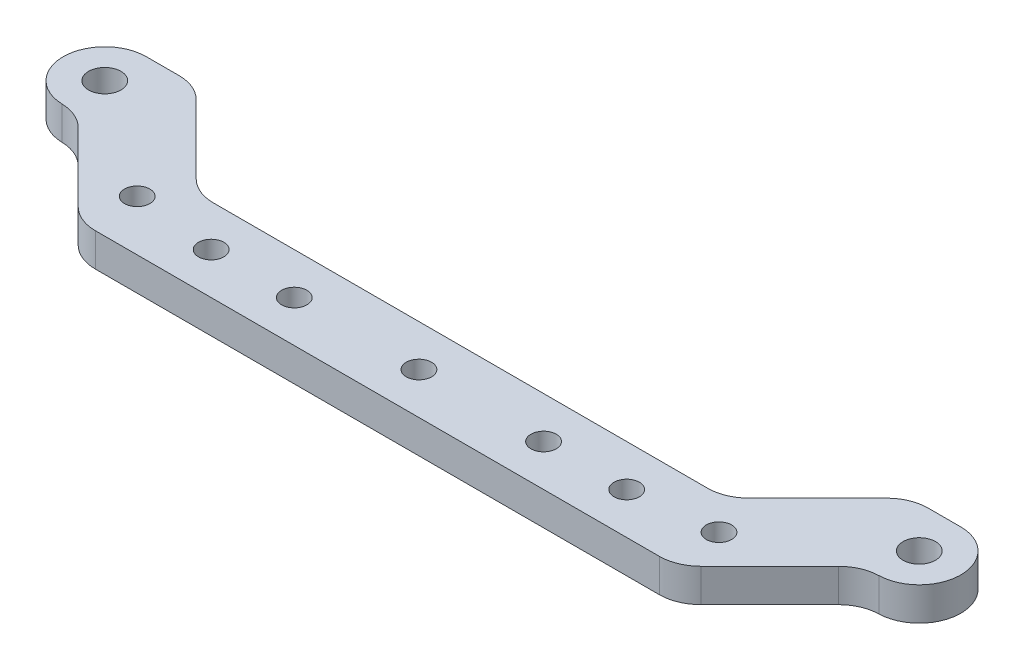
ISO-10303-21;
HEADER;
FILE_DESCRIPTION(('STEP AP214'),'2;1');
FILE_NAME('part.step','',(''),(''),'','','');
FILE_SCHEMA(('AUTOMOTIVE_DESIGN { 1 0 10303 214 1 1 1 1 }'));
ENDSEC;
DATA;
#1=APPLICATION_CONTEXT('core data for automotive mechanical design processes');
#2=APPLICATION_PROTOCOL_DEFINITION('international standard','automotive_design',2000,#1);
#3=PRODUCT_CONTEXT('',#1,'mechanical');
#4=PRODUCT('Part','Part','',(#3));
#5=PRODUCT_RELATED_PRODUCT_CATEGORY('part','',(#4));
#6=PRODUCT_DEFINITION_FORMATION('','',#4);
#7=PRODUCT_DEFINITION_CONTEXT('part definition',#1,'design');
#8=PRODUCT_DEFINITION('design','',#6,#7);
#9=PRODUCT_DEFINITION_SHAPE('','',#8);
#10=(LENGTH_UNIT() NAMED_UNIT(*) SI_UNIT(.MILLI.,.METRE.));
#11=(NAMED_UNIT(*) PLANE_ANGLE_UNIT() SI_UNIT($,.RADIAN.));
#12=(NAMED_UNIT(*) SI_UNIT($,.STERADIAN.) SOLID_ANGLE_UNIT());
#13=UNCERTAINTY_MEASURE_WITH_UNIT(LENGTH_MEASURE(1.E-05),#10,'distance_accuracy_value','');
#14=(GEOMETRIC_REPRESENTATION_CONTEXT(3) GLOBAL_UNCERTAINTY_ASSIGNED_CONTEXT((#13)) GLOBAL_UNIT_ASSIGNED_CONTEXT((#10,
#11,#12)) REPRESENTATION_CONTEXT('',''));
#15=CARTESIAN_POINT('',(0.,0.,0.));
#16=DIRECTION('',(0.,0.,1.));
#17=DIRECTION('',(1.,0.,0.));
#18=AXIS2_PLACEMENT_3D('',#15,#16,#17);
#19=CARTESIAN_POINT('',(43.8391777690971,10.3,-5.00000000000004));
#20=DIRECTION('',(0.,0.,1.));
#21=DIRECTION('',(1.,0.,0.));
#22=AXIS2_PLACEMENT_3D('',#19,#20,#21);
#23=PLANE('',#22);
#24=DIRECTION('',(-1.,0.,0.));
#25=VECTOR('',#24,1.);
#26=CARTESIAN_POINT('',(43.8391777690971,10.3,-5.00000000000004));
#27=LINE('',#26,#25);
#28=CARTESIAN_POINT('',(-50.1710678118657,10.3,-5.00000000000002));
#29=VERTEX_POINT('',#28);
#30=CARTESIAN_POINT('',(-54.1,10.3,-5.00000000000001));
#31=VERTEX_POINT('',#30);
#32=EDGE_CURVE('E244',#29,#31,#27,.T.);
#33=ORIENTED_EDGE('',*,*,#32,.F.);
#34=DIRECTION('',(0.,1.,0.));
#35=VECTOR('',#34,1.);
#36=CARTESIAN_POINT('',(-50.1710678118657,6.30000000000003,-5.00000000000002));
#37=LINE('',#36,#35);
#38=CARTESIAN_POINT('',(-50.1710678118657,6.30000000000003,-5.00000000000002));
#39=VERTEX_POINT('',#38);
#40=EDGE_CURVE('E288',#29,#39,#37,.F.);
#41=ORIENTED_EDGE('',*,*,#40,.T.);
#42=DIRECTION('',(-1.,0.,0.));
#43=VECTOR('',#42,1.);
#44=CARTESIAN_POINT('',(43.8391777690971,6.30000000000003,-5.00000000000004));
#45=LINE('',#44,#43);
#46=CARTESIAN_POINT('',(-54.1,6.30000000000003,-5.00000000000001));
#47=VERTEX_POINT('',#46);
#48=EDGE_CURVE('E258',#39,#47,#45,.T.);
#49=ORIENTED_EDGE('',*,*,#48,.T.);
#50=DIRECTION('',(0.,-1.,0.));
#51=VECTOR('',#50,1.);
#52=CARTESIAN_POINT('',(-54.1,10.3,-5.00000000000001));
#53=LINE('',#52,#51);
#54=EDGE_CURVE('E240',#31,#47,#53,.T.);
#55=ORIENTED_EDGE('',*,*,#54,.F.);
#56=EDGE_LOOP('',(#33,#41,#49,#55));
#57=FACE_BOUND('',#56,.T.);
#58=ADVANCED_FACE('F107',(#57),#23,.F.);
#59=CARTESIAN_POINT('',(-54.1,10.3,0.));
#60=DIRECTION('',(0.,-1.,0.));
#61=DIRECTION('',(0.,0.,-1.));
#62=AXIS2_PLACEMENT_3D('',#59,#60,#61);
#63=CYLINDRICAL_SURFACE('',#62,5.);
#64=CARTESIAN_POINT('',(-54.1,6.30000000000003,0.));
#65=DIRECTION('',(0.,-1.,0.));
#66=DIRECTION('',(0.,0.,-1.));
#67=AXIS2_PLACEMENT_3D('',#64,#65,#66);
#68=CIRCLE('',#67,5.);
#69=CARTESIAN_POINT('',(-54.2374227643268,6.30000000000003,4.99811114160586));
#70=VERTEX_POINT('',#69);
#71=EDGE_CURVE('E358',#70,#47,#68,.T.);
#72=ORIENTED_EDGE('',*,*,#71,.F.);
#73=DIRECTION('',(0.,-1.,0.));
#74=VECTOR('',#73,1.);
#75=CARTESIAN_POINT('',(-54.2374227643268,10.3,4.99811114160586));
#76=LINE('',#75,#74);
#77=CARTESIAN_POINT('',(-54.2374227643268,10.3,4.99811114160586));
#78=VERTEX_POINT('',#77);
#79=EDGE_CURVE('E242',#70,#78,#76,.F.);
#80=ORIENTED_EDGE('',*,*,#79,.T.);
#81=CARTESIAN_POINT('',(-54.1,10.3,0.));
#82=DIRECTION('',(0.,-1.,0.));
#83=DIRECTION('',(0.,0.,-1.));
#84=AXIS2_PLACEMENT_3D('',#81,#82,#83);
#85=CIRCLE('',#84,5.);
#86=EDGE_CURVE('E235',#78,#31,#85,.T.);
#87=ORIENTED_EDGE('',*,*,#86,.T.);
#88=ORIENTED_EDGE('',*,*,#54,.T.);
#89=EDGE_LOOP('',(#72,#80,#87,#88));
#90=FACE_BOUND('',#89,.T.);
#91=ADVANCED_FACE('F238',(#90),#63,.T.);
#92=CARTESIAN_POINT('',(43.8391777690971,10.3,16.2));
#93=DIRECTION('',(0.,0.,1.));
#94=DIRECTION('',(1.,0.,0.));
#95=AXIS2_PLACEMENT_3D('',#92,#93,#94);
#96=PLANE('',#95);
#97=DIRECTION('',(-1.,0.,0.));
#98=VECTOR('',#97,1.);
#99=CARTESIAN_POINT('',(43.8391777690971,6.30000000000003,16.2));
#100=LINE('',#99,#98);
#101=CARTESIAN_POINT('',(28.8289321881344,6.30000000000003,16.2));
#102=VERTEX_POINT('',#101);
#103=CARTESIAN_POINT('',(-39.0289321881343,6.30000000000003,16.2));
#104=VERTEX_POINT('',#103);
#105=EDGE_CURVE('E359',#102,#104,#100,.T.);
#106=ORIENTED_EDGE('',*,*,#105,.F.);
#107=DIRECTION('',(0.,1.,0.));
#108=VECTOR('',#107,1.);
#109=CARTESIAN_POINT('',(28.8289321881344,10.3,16.2));
#110=LINE('',#109,#108);
#111=CARTESIAN_POINT('',(28.8289321881344,10.3,16.2));
#112=VERTEX_POINT('',#111);
#113=EDGE_CURVE('E330',#102,#112,#110,.T.);
#114=ORIENTED_EDGE('',*,*,#113,.T.);
#115=DIRECTION('',(-1.,0.,0.));
#116=VECTOR('',#115,1.);
#117=CARTESIAN_POINT('',(43.8391777690971,10.3,16.2));
#118=LINE('',#117,#116);
#119=CARTESIAN_POINT('',(-39.0289321881343,10.3,16.2));
#120=VERTEX_POINT('',#119);
#121=EDGE_CURVE('E243',#112,#120,#118,.T.);
#122=ORIENTED_EDGE('',*,*,#121,.T.);
#123=DIRECTION('',(0.,1.,0.));
#124=VECTOR('',#123,1.);
#125=CARTESIAN_POINT('',(-39.0289321881343,10.3,16.2));
#126=LINE('',#125,#124);
#127=EDGE_CURVE('E327',#120,#104,#126,.F.);
#128=ORIENTED_EDGE('',*,*,#127,.T.);
#129=EDGE_LOOP('',(#106,#114,#122,#128));
#130=FACE_BOUND('',#129,.T.);
#131=ADVANCED_FACE('F406',(#130),#96,.T.);
#132=CARTESIAN_POINT('',(43.9,10.3,0.));
#133=DIRECTION('',(0.,-1.,0.));
#134=DIRECTION('',(0.,0.,-1.));
#135=AXIS2_PLACEMENT_3D('',#132,#133,#134);
#136=CYLINDRICAL_SURFACE('',#135,5.);
#137=CARTESIAN_POINT('',(43.9,10.3,0.));
#138=DIRECTION('',(0.,-1.,0.));
#139=DIRECTION('',(0.,0.,-1.));
#140=AXIS2_PLACEMENT_3D('',#137,#138,#139);
#141=CIRCLE('',#140,5.);
#142=CARTESIAN_POINT('',(43.9,10.3,-5.00000000000003));
#143=VERTEX_POINT('',#142);
#144=CARTESIAN_POINT('',(44.0374227643268,10.3,4.99811114160585));
#145=VERTEX_POINT('',#144);
#146=EDGE_CURVE('E444',#143,#145,#141,.T.);
#147=ORIENTED_EDGE('',*,*,#146,.T.);
#148=DIRECTION('',(0.,-1.,0.));
#149=VECTOR('',#148,1.);
#150=CARTESIAN_POINT('',(44.0374227643268,10.3,4.99811114160585));
#151=LINE('',#150,#149);
#152=CARTESIAN_POINT('',(44.0374227643268,6.30000000000003,4.99811114160585));
#153=VERTEX_POINT('',#152);
#154=EDGE_CURVE('E320',#145,#153,#151,.T.);
#155=ORIENTED_EDGE('',*,*,#154,.T.);
#156=CARTESIAN_POINT('',(43.9,6.30000000000003,0.));
#157=DIRECTION('',(0.,-1.,0.));
#158=DIRECTION('',(0.,0.,-1.));
#159=AXIS2_PLACEMENT_3D('',#156,#157,#158);
#160=CIRCLE('',#159,5.);
#161=CARTESIAN_POINT('',(43.9,6.30000000000003,-5.00000000000003));
#162=VERTEX_POINT('',#161);
#163=EDGE_CURVE('E362',#162,#153,#160,.T.);
#164=ORIENTED_EDGE('',*,*,#163,.F.);
#165=DIRECTION('',(0.,-1.,0.));
#166=VECTOR('',#165,1.);
#167=CARTESIAN_POINT('',(43.9,10.3,-5.00000000000003));
#168=LINE('',#167,#166);
#169=EDGE_CURVE('E260',#143,#162,#168,.T.);
#170=ORIENTED_EDGE('',*,*,#169,.F.);
#171=EDGE_LOOP('',(#147,#155,#164,#170));
#172=FACE_BOUND('',#171,.T.);
#173=ADVANCED_FACE('F447',(#172),#136,.T.);
#174=CARTESIAN_POINT('',(43.8391777690971,10.3,-5.00000000000003));
#175=DIRECTION('',(0.,0.,-1.));
#176=DIRECTION('',(-1.,0.,0.));
#177=AXIS2_PLACEMENT_3D('',#174,#175,#176);
#178=PLANE('',#177);
#179=DIRECTION('',(1.,0.,0.));
#180=VECTOR('',#179,1.);
#181=CARTESIAN_POINT('',(43.8391777690971,6.30000000000003,-5.00000000000003));
#182=LINE('',#181,#180);
#183=CARTESIAN_POINT('',(39.9710678118656,6.30000000000003,-5.00000000000003));
#184=VERTEX_POINT('',#183);
#185=EDGE_CURVE('E370',#184,#162,#182,.T.);
#186=ORIENTED_EDGE('',*,*,#185,.F.);
#187=DIRECTION('',(0.,-1.,0.));
#188=VECTOR('',#187,1.);
#189=CARTESIAN_POINT('',(39.9710678118656,10.3,-5.00000000000003));
#190=LINE('',#189,#188);
#191=CARTESIAN_POINT('',(39.9710678118656,10.3,-5.00000000000003));
#192=VERTEX_POINT('',#191);
#193=EDGE_CURVE('E317',#184,#192,#190,.F.);
#194=ORIENTED_EDGE('',*,*,#193,.T.);
#195=DIRECTION('',(1.,0.,0.));
#196=VECTOR('',#195,1.);
#197=CARTESIAN_POINT('',(43.8391777690971,10.3,-5.00000000000003));
#198=LINE('',#197,#196);
#199=EDGE_CURVE('E449',#192,#143,#198,.T.);
#200=ORIENTED_EDGE('',*,*,#199,.T.);
#201=ORIENTED_EDGE('',*,*,#169,.T.);
#202=EDGE_LOOP('',(#186,#194,#200,#201));
#203=FACE_BOUND('',#202,.T.);
#204=ADVANCED_FACE('F550',(#203),#178,.T.);
#205=CARTESIAN_POINT('',(43.8391777690971,10.3,6.19999999999983));
#206=DIRECTION('',(0.,0.,1.));
#207=DIRECTION('',(1.,0.,0.));
#208=AXIS2_PLACEMENT_3D('',#205,#206,#207);
#209=PLANE('',#208);
#210=DIRECTION('',(-1.,0.,0.));
#211=VECTOR('',#210,1.);
#212=CARTESIAN_POINT('',(43.8391777690971,6.30000000000003,6.19999999999983));
#213=LINE('',#212,#211);
#214=CARTESIAN_POINT('',(24.6289321881348,6.30000000000003,6.19999999999987));
#215=VERTEX_POINT('',#214);
#216=CARTESIAN_POINT('',(-34.8289321881346,6.30000000000003,6.19999999999999));
#217=VERTEX_POINT('',#216);
#218=EDGE_CURVE('E254',#215,#217,#213,.T.);
#219=ORIENTED_EDGE('',*,*,#218,.T.);
#220=DIRECTION('',(0.,-1.,0.));
#221=VECTOR('',#220,1.);
#222=CARTESIAN_POINT('',(-34.8289321881346,10.3,6.19999999999999));
#223=LINE('',#222,#221);
#224=CARTESIAN_POINT('',(-34.8289321881346,10.3,6.19999999999999));
#225=VERTEX_POINT('',#224);
#226=EDGE_CURVE('E310',#217,#225,#223,.F.);
#227=ORIENTED_EDGE('',*,*,#226,.T.);
#228=DIRECTION('',(-1.,0.,0.));
#229=VECTOR('',#228,1.);
#230=CARTESIAN_POINT('',(43.8391777690971,10.3,6.19999999999983));
#231=LINE('',#230,#229);
#232=CARTESIAN_POINT('',(24.6289321881348,10.3,6.19999999999987));
#233=VERTEX_POINT('',#232);
#234=EDGE_CURVE('E266',#233,#225,#231,.T.);
#235=ORIENTED_EDGE('',*,*,#234,.F.);
#236=DIRECTION('',(0.,1.,0.));
#237=VECTOR('',#236,1.);
#238=CARTESIAN_POINT('',(24.6289321881348,10.3,6.19999999999987));
#239=LINE('',#238,#237);
#240=EDGE_CURVE('E307',#233,#215,#239,.F.);
#241=ORIENTED_EDGE('',*,*,#240,.T.);
#242=EDGE_LOOP('',(#219,#227,#235,#241));
#243=FACE_BOUND('',#242,.T.);
#244=ADVANCED_FACE('F375',(#243),#209,.F.);
#245=CARTESIAN_POINT('',(-54.1,10.3,0.));
#246=DIRECTION('',(0.,-1.,0.));
#247=DIRECTION('',(0.,0.,-1.));
#248=AXIS2_PLACEMENT_3D('',#245,#246,#247);
#249=PLANE('',#248);
#250=CARTESIAN_POINT('',(29.9000000000001,10.3,10.0999999999999));
#251=DIRECTION('',(0.,1.,0.));
#252=DIRECTION('',(0.,0.,1.));
#253=AXIS2_PLACEMENT_3D('',#250,#251,#252);
#254=CIRCLE('',#253,1.52499999999999);
#255=CARTESIAN_POINT('',(29.9000000000001,10.3,11.6249999999999));
#256=VERTEX_POINT('',#255);
#257=EDGE_CURVE('E491',#256,#256,#254,.T.);
#258=ORIENTED_EDGE('',*,*,#257,.F.);
#259=EDGE_LOOP('',(#258));
#260=FACE_BOUND('',#259,.T.);
#261=CARTESIAN_POINT('',(-30.0999999999999,10.3,11.2));
#262=DIRECTION('',(0.,1.,0.));
#263=DIRECTION('',(0.,0.,-1.));
#264=AXIS2_PLACEMENT_3D('',#261,#262,#263);
#265=CIRCLE('',#264,1.525);
#266=CARTESIAN_POINT('',(-30.0999999999999,10.3,9.67500000000002));
#267=VERTEX_POINT('',#266);
#268=EDGE_CURVE('E495',#267,#267,#265,.T.);
#269=ORIENTED_EDGE('',*,*,#268,.F.);
#270=EDGE_LOOP('',(#269));
#271=FACE_BOUND('',#270,.T.);
#272=CARTESIAN_POINT('',(19.9000000000001,10.3,11.2));
#273=DIRECTION('',(0.,1.,0.));
#274=DIRECTION('',(0.,0.,1.));
#275=AXIS2_PLACEMENT_3D('',#272,#273,#274);
#276=CIRCLE('',#275,1.525);
#277=CARTESIAN_POINT('',(19.9000000000001,10.3,12.725));
#278=VERTEX_POINT('',#277);
#279=EDGE_CURVE('E470',#278,#278,#276,.T.);
#280=ORIENTED_EDGE('',*,*,#279,.F.);
#281=EDGE_LOOP('',(#280));
#282=FACE_BOUND('',#281,.T.);
#283=CARTESIAN_POINT('',(-20.0999999999999,10.3,11.2));
#284=DIRECTION('',(0.,1.,0.));
#285=DIRECTION('',(0.,0.,-1.));
#286=AXIS2_PLACEMENT_3D('',#283,#284,#285);
#287=CIRCLE('',#286,1.525);
#288=CARTESIAN_POINT('',(-20.0999999999999,10.3,9.67500000000001));
#289=VERTEX_POINT('',#288);
#290=EDGE_CURVE('E469',#289,#289,#287,.T.);
#291=ORIENTED_EDGE('',*,*,#290,.F.);
#292=EDGE_LOOP('',(#291));
#293=FACE_BOUND('',#292,.T.);
#294=CARTESIAN_POINT('',(-40.0999999999999,10.3,10.0999999999999));
#295=DIRECTION('',(0.,1.,0.));
#296=DIRECTION('',(0.,0.,-1.));
#297=AXIS2_PLACEMENT_3D('',#294,#295,#296);
#298=CIRCLE('',#297,1.525);
#299=CARTESIAN_POINT('',(-40.0999999999999,10.3,8.57499999999995));
#300=VERTEX_POINT('',#299);
#301=EDGE_CURVE('E476',#300,#300,#298,.T.);
#302=ORIENTED_EDGE('',*,*,#301,.F.);
#303=EDGE_LOOP('',(#302));
#304=FACE_BOUND('',#303,.T.);
#305=CARTESIAN_POINT('',(9.9000000000001,10.3,11.2));
#306=DIRECTION('',(0.,1.,0.));
#307=DIRECTION('',(0.,0.,1.));
#308=AXIS2_PLACEMENT_3D('',#305,#306,#307);
#309=CIRCLE('',#308,1.525);
#310=CARTESIAN_POINT('',(9.9000000000001,10.3,12.725));
#311=VERTEX_POINT('',#310);
#312=EDGE_CURVE('E482',#311,#311,#309,.T.);
#313=ORIENTED_EDGE('',*,*,#312,.F.);
#314=EDGE_LOOP('',(#313));
#315=FACE_BOUND('',#314,.T.);
#316=CARTESIAN_POINT('',(-5.0999999999999,10.3,11.2));
#317=DIRECTION('',(0.,1.,0.));
#318=DIRECTION('',(0.,0.,1.));
#319=AXIS2_PLACEMENT_3D('',#316,#317,#318);
#320=CIRCLE('',#319,1.525);
#321=CARTESIAN_POINT('',(-5.0999999999999,10.3,12.725));
#322=VERTEX_POINT('',#321);
#323=EDGE_CURVE('E488',#322,#322,#320,.T.);
#324=ORIENTED_EDGE('',*,*,#323,.F.);
#325=EDGE_LOOP('',(#324));
#326=FACE_BOUND('',#325,.T.);
#327=CARTESIAN_POINT('',(-54.1,10.3,0.));
#328=DIRECTION('',(0.,-1.,0.));
#329=DIRECTION('',(0.,0.,-1.));
#330=AXIS2_PLACEMENT_3D('',#327,#328,#329);
#331=CIRCLE('',#330,1.95);
#332=CARTESIAN_POINT('',(-54.1,10.3,-1.95000000000001));
#333=VERTEX_POINT('',#332);
#334=EDGE_CURVE('E457',#333,#333,#331,.T.);
#335=ORIENTED_EDGE('',*,*,#334,.T.);
#336=EDGE_LOOP('',(#335));
#337=FACE_BOUND('',#336,.T.);
#338=CARTESIAN_POINT('',(43.9,10.3,0.));
#339=DIRECTION('',(0.,-1.,0.));
#340=DIRECTION('',(0.,0.,-1.));
#341=AXIS2_PLACEMENT_3D('',#338,#339,#340);
#342=CIRCLE('',#341,1.95);
#343=CARTESIAN_POINT('',(43.9,10.3,-1.95000000000003));
#344=VERTEX_POINT('',#343);
#345=EDGE_CURVE('E364',#344,#344,#342,.T.);
#346=ORIENTED_EDGE('',*,*,#345,.T.);
#347=EDGE_LOOP('',(#346));
#348=FACE_BOUND('',#347,.T.);
#349=DIRECTION('',(0.707106781186551,0.,0.707106781186544));
#350=VECTOR('',#349,1.);
#351=CARTESIAN_POINT('',(-48.1000000000002,10.3,-5.00000000000002));
#352=LINE('',#351,#350);
#353=CARTESIAN_POINT('',(-38.3644660940674,10.3,4.73553390593275));
#354=VERTEX_POINT('',#353);
#355=CARTESIAN_POINT('',(-46.635533905933,10.3,-3.53553390593278));
#356=VERTEX_POINT('',#355);
#357=EDGE_CURVE('E272',#354,#356,#352,.F.);
#358=ORIENTED_EDGE('',*,*,#357,.T.);
#359=CARTESIAN_POINT('',(-50.1710678118657,10.3,0.));
#360=DIRECTION('',(0.,-1.,0.));
#361=DIRECTION('',(0.,0.,-1.));
#362=AXIS2_PLACEMENT_3D('',#359,#360,#361);
#363=CIRCLE('',#362,5.);
#364=EDGE_CURVE('E250',#356,#29,#363,.F.);
#365=ORIENTED_EDGE('',*,*,#364,.T.);
#366=ORIENTED_EDGE('',*,*,#32,.T.);
#367=ORIENTED_EDGE('',*,*,#86,.F.);
#368=CARTESIAN_POINT('',(-54.3748455286536,10.3,9.99622228321173));
#369=DIRECTION('',(0.,-1.,0.));
#370=DIRECTION('',(0.,0.,-1.));
#371=AXIS2_PLACEMENT_3D('',#368,#369,#370);
#372=CIRCLE('',#371,5.);
#373=CARTESIAN_POINT('',(-50.8393116227209,10.3,6.46068837727897));
#374=VERTEX_POINT('',#373);
#375=EDGE_CURVE('E115',#78,#374,#372,.T.);
#376=ORIENTED_EDGE('',*,*,#375,.T.);
#377=DIRECTION('',(-0.707106781186552,0.,-0.707106781186543));
#378=VECTOR('',#377,1.);
#379=CARTESIAN_POINT('',(-41.0999999999998,10.3,16.2));
#380=LINE('',#379,#378);
#381=CARTESIAN_POINT('',(-42.564466094067,10.3,14.7355339059328));
#382=VERTEX_POINT('',#381);
#383=EDGE_CURVE('E283',#374,#382,#380,.F.);
#384=ORIENTED_EDGE('',*,*,#383,.T.);
#385=CARTESIAN_POINT('',(-39.0289321881343,10.3,11.2));
#386=DIRECTION('',(0.,-1.,0.));
#387=DIRECTION('',(0.,0.,-1.));
#388=AXIS2_PLACEMENT_3D('',#385,#386,#387);
#389=CIRCLE('',#388,5.);
#390=EDGE_CURVE('E122',#382,#120,#389,.F.);
#391=ORIENTED_EDGE('',*,*,#390,.T.);
#392=ORIENTED_EDGE('',*,*,#121,.F.);
#393=CARTESIAN_POINT('',(28.8289321881344,10.3,11.2));
#394=DIRECTION('',(0.,-1.,0.));
#395=DIRECTION('',(0.,0.,-1.));
#396=AXIS2_PLACEMENT_3D('',#393,#394,#395);
#397=CIRCLE('',#396,5.);
#398=CARTESIAN_POINT('',(32.3644660940672,10.3,14.7355339059327));
#399=VERTEX_POINT('',#398);
#400=EDGE_CURVE('E130',#112,#399,#397,.F.);
#401=ORIENTED_EDGE('',*,*,#400,.T.);
#402=DIRECTION('',(0.707106781186544,0.,-0.707106781186551));
#403=VECTOR('',#402,1.);
#404=CARTESIAN_POINT('',(43.9,10.3,3.19999999999975));
#405=LINE('',#404,#403);
#406=CARTESIAN_POINT('',(40.6393116227208,10.3,6.460688377279));
#407=VERTEX_POINT('',#406);
#408=EDGE_CURVE('E285',#399,#407,#405,.T.);
#409=ORIENTED_EDGE('',*,*,#408,.T.);
#410=CARTESIAN_POINT('',(44.1748455286536,10.3,9.99622228321172));
#411=DIRECTION('',(0.,-1.,0.));
#412=DIRECTION('',(0.,0.,-1.));
#413=AXIS2_PLACEMENT_3D('',#410,#411,#412);
#414=CIRCLE('',#413,5.);
#415=EDGE_CURVE('E347',#407,#145,#414,.T.);
#416=ORIENTED_EDGE('',*,*,#415,.T.);
#417=ORIENTED_EDGE('',*,*,#146,.F.);
#418=ORIENTED_EDGE('',*,*,#199,.F.);
#419=CARTESIAN_POINT('',(39.9710678118656,10.3,0.));
#420=DIRECTION('',(0.,-1.,0.));
#421=DIRECTION('',(0.,0.,-1.));
#422=AXIS2_PLACEMENT_3D('',#419,#420,#421);
#423=CIRCLE('',#422,5.);
#424=CARTESIAN_POINT('',(36.4355339059328,10.3,-3.53553390593275));
#425=VERTEX_POINT('',#424);
#426=EDGE_CURVE('E304',#192,#425,#423,.F.);
#427=ORIENTED_EDGE('',*,*,#426,.T.);
#428=DIRECTION('',(0.707106781186544,0.,-0.707106781186551));
#429=VECTOR('',#428,1.);
#430=CARTESIAN_POINT('',(24.9,10.3,8.0000000000002));
#431=LINE('',#430,#429);
#432=CARTESIAN_POINT('',(28.1644660940676,10.3,4.73553390593259));
#433=VERTEX_POINT('',#432);
#434=EDGE_CURVE('E274',#425,#433,#431,.F.);
#435=ORIENTED_EDGE('',*,*,#434,.T.);
#436=CARTESIAN_POINT('',(24.6289321881348,10.3,1.19999999999987));
#437=DIRECTION('',(0.,-1.,0.));
#438=DIRECTION('',(0.,0.,-1.));
#439=AXIS2_PLACEMENT_3D('',#436,#437,#438);
#440=CIRCLE('',#439,5.);
#441=EDGE_CURVE('E343',#433,#233,#440,.T.);
#442=ORIENTED_EDGE('',*,*,#441,.T.);
#443=ORIENTED_EDGE('',*,*,#234,.T.);
#444=CARTESIAN_POINT('',(-34.8289321881346,10.3,1.19999999999999));
#445=DIRECTION('',(0.,-1.,0.));
#446=DIRECTION('',(0.,0.,-1.));
#447=AXIS2_PLACEMENT_3D('',#444,#445,#446);
#448=CIRCLE('',#447,5.);
#449=EDGE_CURVE('E337',#225,#354,#448,.T.);
#450=ORIENTED_EDGE('',*,*,#449,.T.);
#451=EDGE_LOOP('',(#358,#365,#366,#367,#376,#384,#391,#392,#401,#409,#416,#417,#418,#427,#435,
#442,#443,#450));
#452=FACE_BOUND('',#451,.T.);
#453=ADVANCED_FACE('F248',(#260,#271,#282,#293,#304,#315,#326,#337,#348,#452),#249,.F.);
#454=CARTESIAN_POINT('',(-54.1,6.30000000000003,0.));
#455=DIRECTION('',(0.,-1.,0.));
#456=DIRECTION('',(0.,0.,-1.));
#457=AXIS2_PLACEMENT_3D('',#454,#455,#456);
#458=PLANE('',#457);
#459=CARTESIAN_POINT('',(29.9000000000001,6.30000000000003,10.0999999999999));
#460=DIRECTION('',(0.,1.,0.));
#461=DIRECTION('',(0.,0.,1.));
#462=AXIS2_PLACEMENT_3D('',#459,#460,#461);
#463=CIRCLE('',#462,1.52499999999999);
#464=CARTESIAN_POINT('',(29.9000000000001,6.30000000000003,11.6249999999999));
#465=VERTEX_POINT('',#464);
#466=EDGE_CURVE('E463',#465,#465,#463,.T.);
#467=ORIENTED_EDGE('',*,*,#466,.T.);
#468=EDGE_LOOP('',(#467));
#469=FACE_BOUND('',#468,.T.);
#470=CARTESIAN_POINT('',(-30.0999999999999,6.30000000000003,11.2));
#471=DIRECTION('',(0.,1.,0.));
#472=DIRECTION('',(0.,0.,-1.));
#473=AXIS2_PLACEMENT_3D('',#470,#471,#472);
#474=CIRCLE('',#473,1.525);
#475=CARTESIAN_POINT('',(-30.0999999999999,6.30000000000003,9.67500000000002));
#476=VERTEX_POINT('',#475);
#477=EDGE_CURVE('E492',#476,#476,#474,.T.);
#478=ORIENTED_EDGE('',*,*,#477,.T.);
#479=EDGE_LOOP('',(#478));
#480=FACE_BOUND('',#479,.T.);
#481=CARTESIAN_POINT('',(19.9000000000001,6.30000000000003,11.2));
#482=DIRECTION('',(0.,1.,0.));
#483=DIRECTION('',(0.,0.,1.));
#484=AXIS2_PLACEMENT_3D('',#481,#482,#483);
#485=CIRCLE('',#484,1.525);
#486=CARTESIAN_POINT('',(19.9000000000001,6.30000000000003,12.725));
#487=VERTEX_POINT('',#486);
#488=EDGE_CURVE('E498',#487,#487,#485,.T.);
#489=ORIENTED_EDGE('',*,*,#488,.T.);
#490=EDGE_LOOP('',(#489));
#491=FACE_BOUND('',#490,.T.);
#492=CARTESIAN_POINT('',(-20.0999999999999,6.30000000000003,11.2));
#493=DIRECTION('',(0.,1.,0.));
#494=DIRECTION('',(0.,0.,-1.));
#495=AXIS2_PLACEMENT_3D('',#492,#493,#494);
#496=CIRCLE('',#495,1.525);
#497=CARTESIAN_POINT('',(-20.0999999999999,6.30000000000003,9.67500000000001));
#498=VERTEX_POINT('',#497);
#499=EDGE_CURVE('E466',#498,#498,#496,.T.);
#500=ORIENTED_EDGE('',*,*,#499,.T.);
#501=EDGE_LOOP('',(#500));
#502=FACE_BOUND('',#501,.T.);
#503=CARTESIAN_POINT('',(-40.0999999999999,6.30000000000003,10.0999999999999));
#504=DIRECTION('',(0.,1.,0.));
#505=DIRECTION('',(0.,0.,-1.));
#506=AXIS2_PLACEMENT_3D('',#503,#504,#505);
#507=CIRCLE('',#506,1.525);
#508=CARTESIAN_POINT('',(-40.0999999999999,6.30000000000003,8.57499999999995));
#509=VERTEX_POINT('',#508);
#510=EDGE_CURVE('E473',#509,#509,#507,.T.);
#511=ORIENTED_EDGE('',*,*,#510,.T.);
#512=EDGE_LOOP('',(#511));
#513=FACE_BOUND('',#512,.T.);
#514=CARTESIAN_POINT('',(9.9000000000001,6.30000000000003,11.2));
#515=DIRECTION('',(0.,1.,0.));
#516=DIRECTION('',(0.,0.,1.));
#517=AXIS2_PLACEMENT_3D('',#514,#515,#516);
#518=CIRCLE('',#517,1.525);
#519=CARTESIAN_POINT('',(9.9000000000001,6.30000000000003,12.725));
#520=VERTEX_POINT('',#519);
#521=EDGE_CURVE('E479',#520,#520,#518,.T.);
#522=ORIENTED_EDGE('',*,*,#521,.T.);
#523=EDGE_LOOP('',(#522));
#524=FACE_BOUND('',#523,.T.);
#525=CARTESIAN_POINT('',(-5.0999999999999,6.30000000000003,11.2));
#526=DIRECTION('',(0.,1.,0.));
#527=DIRECTION('',(0.,0.,1.));
#528=AXIS2_PLACEMENT_3D('',#525,#526,#527);
#529=CIRCLE('',#528,1.525);
#530=CARTESIAN_POINT('',(-5.0999999999999,6.30000000000003,12.725));
#531=VERTEX_POINT('',#530);
#532=EDGE_CURVE('E485',#531,#531,#529,.T.);
#533=ORIENTED_EDGE('',*,*,#532,.T.);
#534=EDGE_LOOP('',(#533));
#535=FACE_BOUND('',#534,.T.);
#536=CARTESIAN_POINT('',(-54.1,6.30000000000003,0.));
#537=DIRECTION('',(0.,-1.,0.));
#538=DIRECTION('',(0.,0.,-1.));
#539=AXIS2_PLACEMENT_3D('',#536,#537,#538);
#540=CIRCLE('',#539,1.95);
#541=CARTESIAN_POINT('',(-54.1,6.30000000000003,-1.95000000000001));
#542=VERTEX_POINT('',#541);
#543=EDGE_CURVE('E460',#542,#542,#540,.T.);
#544=ORIENTED_EDGE('',*,*,#543,.F.);
#545=EDGE_LOOP('',(#544));
#546=FACE_BOUND('',#545,.T.);
#547=CARTESIAN_POINT('',(43.9,6.30000000000003,0.));
#548=DIRECTION('',(0.,-1.,0.));
#549=DIRECTION('',(0.,0.,-1.));
#550=AXIS2_PLACEMENT_3D('',#547,#548,#549);
#551=CIRCLE('',#550,1.95);
#552=CARTESIAN_POINT('',(43.9,6.30000000000003,-1.95000000000003));
#553=VERTEX_POINT('',#552);
#554=EDGE_CURVE('E454',#553,#553,#551,.T.);
#555=ORIENTED_EDGE('',*,*,#554,.F.);
#556=EDGE_LOOP('',(#555));
#557=FACE_BOUND('',#556,.T.);
#558=ORIENTED_EDGE('',*,*,#48,.F.);
#559=CARTESIAN_POINT('',(-50.1710678118657,6.30000000000003,0.));
#560=DIRECTION('',(0.,-1.,0.));
#561=DIRECTION('',(0.,0.,-1.));
#562=AXIS2_PLACEMENT_3D('',#559,#560,#561);
#563=CIRCLE('',#562,5.);
#564=CARTESIAN_POINT('',(-46.635533905933,6.30000000000003,-3.53553390593278));
#565=VERTEX_POINT('',#564);
#566=EDGE_CURVE('E296',#39,#565,#563,.T.);
#567=ORIENTED_EDGE('',*,*,#566,.T.);
#568=DIRECTION('',(-0.707106781186551,0.,-0.707106781186544));
#569=VECTOR('',#568,1.);
#570=CARTESIAN_POINT('',(-48.6000000000002,6.30000000000003,-5.49999999999992));
#571=LINE('',#570,#569);
#572=CARTESIAN_POINT('',(-38.3644660940674,6.30000000000003,4.73553390593275));
#573=VERTEX_POINT('',#572);
#574=EDGE_CURVE('E259',#565,#573,#571,.F.);
#575=ORIENTED_EDGE('',*,*,#574,.T.);
#576=CARTESIAN_POINT('',(-34.8289321881346,6.30000000000003,1.19999999999999));
#577=DIRECTION('',(0.,-1.,0.));
#578=DIRECTION('',(0.,0.,-1.));
#579=AXIS2_PLACEMENT_3D('',#576,#577,#578);
#580=CIRCLE('',#579,5.);
#581=EDGE_CURVE('E339',#573,#217,#580,.F.);
#582=ORIENTED_EDGE('',*,*,#581,.T.);
#583=ORIENTED_EDGE('',*,*,#218,.F.);
#584=CARTESIAN_POINT('',(24.6289321881348,6.30000000000003,1.19999999999987));
#585=DIRECTION('',(0.,-1.,0.));
#586=DIRECTION('',(0.,0.,-1.));
#587=AXIS2_PLACEMENT_3D('',#584,#585,#586);
#588=CIRCLE('',#587,5.);
#589=CARTESIAN_POINT('',(28.1644660940676,6.30000000000003,4.73553390593258));
#590=VERTEX_POINT('',#589);
#591=EDGE_CURVE('E341',#215,#590,#588,.F.);
#592=ORIENTED_EDGE('',*,*,#591,.T.);
#593=DIRECTION('',(-0.707106781186544,0.,0.707106781186551));
#594=VECTOR('',#593,1.);
#595=CARTESIAN_POINT('',(-10.5999999999995,6.30000000000003,43.5));
#596=LINE('',#595,#594);
#597=CARTESIAN_POINT('',(36.4355339059328,6.30000000000003,-3.53553390593275));
#598=VERTEX_POINT('',#597);
#599=EDGE_CURVE('E263',#590,#598,#596,.F.);
#600=ORIENTED_EDGE('',*,*,#599,.T.);
#601=CARTESIAN_POINT('',(39.9710678118656,6.30000000000003,0.));
#602=DIRECTION('',(0.,-1.,0.));
#603=DIRECTION('',(0.,0.,-1.));
#604=AXIS2_PLACEMENT_3D('',#601,#602,#603);
#605=CIRCLE('',#604,5.);
#606=EDGE_CURVE('E294',#598,#184,#605,.T.);
#607=ORIENTED_EDGE('',*,*,#606,.T.);
#608=ORIENTED_EDGE('',*,*,#185,.T.);
#609=ORIENTED_EDGE('',*,*,#163,.T.);
#610=CARTESIAN_POINT('',(44.1748455286536,6.30000000000003,9.99622228321172));
#611=DIRECTION('',(0.,-1.,0.));
#612=DIRECTION('',(0.,0.,-1.));
#613=AXIS2_PLACEMENT_3D('',#610,#611,#612);
#614=CIRCLE('',#613,5.);
#615=CARTESIAN_POINT('',(40.6393116227208,6.30000000000003,6.46068837727899));
#616=VERTEX_POINT('',#615);
#617=EDGE_CURVE('E345',#153,#616,#614,.F.);
#618=ORIENTED_EDGE('',*,*,#617,.T.);
#619=DIRECTION('',(-0.707106781186544,0.,0.707106781186551));
#620=VECTOR('',#619,1.);
#621=CARTESIAN_POINT('',(-3.49999999999959,6.30000000000003,50.5999999999999));
#622=LINE('',#621,#620);
#623=CARTESIAN_POINT('',(32.3644660940672,6.30000000000003,14.7355339059327));
#624=VERTEX_POINT('',#623);
#625=EDGE_CURVE('E280',#616,#624,#622,.T.);
#626=ORIENTED_EDGE('',*,*,#625,.T.);
#627=CARTESIAN_POINT('',(28.8289321881344,6.30000000000003,11.2));
#628=DIRECTION('',(0.,-1.,0.));
#629=DIRECTION('',(0.,0.,-1.));
#630=AXIS2_PLACEMENT_3D('',#627,#628,#629);
#631=CIRCLE('',#630,5.);
#632=EDGE_CURVE('E292',#624,#102,#631,.T.);
#633=ORIENTED_EDGE('',*,*,#632,.T.);
#634=ORIENTED_EDGE('',*,*,#105,.T.);
#635=CARTESIAN_POINT('',(-39.0289321881343,6.30000000000003,11.2));
#636=DIRECTION('',(0.,-1.,0.));
#637=DIRECTION('',(0.,0.,-1.));
#638=AXIS2_PLACEMENT_3D('',#635,#636,#637);
#639=CIRCLE('',#638,5.);
#640=CARTESIAN_POINT('',(-42.564466094067,6.30000000000003,14.7355339059328));
#641=VERTEX_POINT('',#640);
#642=EDGE_CURVE('E290',#104,#641,#639,.T.);
#643=ORIENTED_EDGE('',*,*,#642,.T.);
#644=DIRECTION('',(0.707106781186552,0.,0.707106781186543));
#645=VECTOR('',#644,1.);
#646=CARTESIAN_POINT('',(-55.7,6.30000000000003,1.59999999999998));
#647=LINE('',#646,#645);
#648=CARTESIAN_POINT('',(-50.8393116227209,6.30000000000003,6.46068837727897));
#649=VERTEX_POINT('',#648);
#650=EDGE_CURVE('E277',#641,#649,#647,.F.);
#651=ORIENTED_EDGE('',*,*,#650,.T.);
#652=CARTESIAN_POINT('',(-54.3748455286536,6.30000000000003,9.99622228321173));
#653=DIRECTION('',(0.,-1.,0.));
#654=DIRECTION('',(0.,0.,-1.));
#655=AXIS2_PLACEMENT_3D('',#652,#653,#654);
#656=CIRCLE('',#655,5.);
#657=EDGE_CURVE('E12',#649,#70,#656,.F.);
#658=ORIENTED_EDGE('',*,*,#657,.T.);
#659=ORIENTED_EDGE('',*,*,#71,.T.);
#660=EDGE_LOOP('',(#558,#567,#575,#582,#583,#592,#600,#607,#608,#609,#618,#626,#633,#634,#643,
#651,#658,#659));
#661=FACE_BOUND('',#660,.T.);
#662=ADVANCED_FACE('F357',(#469,#480,#491,#502,#513,#524,#535,#546,#557,#661),#458,.T.);
#663=CARTESIAN_POINT('',(43.9,10.3,0.));
#664=DIRECTION('',(0.,-1.,0.));
#665=DIRECTION('',(0.,0.,-1.));
#666=AXIS2_PLACEMENT_3D('',#663,#664,#665);
#667=CYLINDRICAL_SURFACE('',#666,1.95);
#668=ORIENTED_EDGE('',*,*,#345,.F.);
#669=EDGE_LOOP('',(#668));
#670=FACE_BOUND('',#669,.T.);
#671=ORIENTED_EDGE('',*,*,#554,.T.);
#672=EDGE_LOOP('',(#671));
#673=FACE_BOUND('',#672,.T.);
#674=ADVANCED_FACE('F536',(#670,#673),#667,.F.);
#675=CARTESIAN_POINT('',(-54.1,10.3,0.));
#676=DIRECTION('',(0.,-1.,0.));
#677=DIRECTION('',(0.,0.,-1.));
#678=AXIS2_PLACEMENT_3D('',#675,#676,#677);
#679=CYLINDRICAL_SURFACE('',#678,1.95);
#680=ORIENTED_EDGE('',*,*,#334,.F.);
#681=EDGE_LOOP('',(#680));
#682=FACE_BOUND('',#681,.T.);
#683=ORIENTED_EDGE('',*,*,#543,.T.);
#684=EDGE_LOOP('',(#683));
#685=FACE_BOUND('',#684,.T.);
#686=ADVANCED_FACE('F417',(#682,#685),#679,.F.);
#687=CARTESIAN_POINT('',(24.9,10.3,8.0000000000002));
#688=DIRECTION('',(0.707106781186551,0.,0.707106781186544));
#689=DIRECTION('',(0.,-1.,0.));
#690=AXIS2_PLACEMENT_3D('',#687,#688,#689);
#691=PLANE('',#690);
#692=ORIENTED_EDGE('',*,*,#599,.F.);
#693=DIRECTION('',(0.,-1.,0.));
#694=VECTOR('',#693,1.);
#695=CARTESIAN_POINT('',(28.1644660940676,10.3,4.73553390593259));
#696=LINE('',#695,#694);
#697=EDGE_CURVE('E315',#590,#433,#696,.F.);
#698=ORIENTED_EDGE('',*,*,#697,.T.);
#699=ORIENTED_EDGE('',*,*,#434,.F.);
#700=DIRECTION('',(0.,1.,0.));
#701=VECTOR('',#700,1.);
#702=CARTESIAN_POINT('',(36.4355339059328,10.3,-3.53553390593274));
#703=LINE('',#702,#701);
#704=EDGE_CURVE('E313',#425,#598,#703,.F.);
#705=ORIENTED_EDGE('',*,*,#704,.T.);
#706=EDGE_LOOP('',(#692,#698,#699,#705));
#707=FACE_BOUND('',#706,.T.);
#708=ADVANCED_FACE('F411',(#707),#691,.F.);
#709=CARTESIAN_POINT('',(-48.1000000000002,10.3,-5.00000000000002));
#710=DIRECTION('',(-0.707106781186544,0.,0.707106781186552));
#711=DIRECTION('',(0.,-1.,0.));
#712=AXIS2_PLACEMENT_3D('',#709,#710,#711);
#713=PLANE('',#712);
#714=ORIENTED_EDGE('',*,*,#574,.F.);
#715=DIRECTION('',(0.,-1.,0.));
#716=VECTOR('',#715,1.);
#717=CARTESIAN_POINT('',(-46.635533905933,10.3,-3.53553390593278));
#718=LINE('',#717,#716);
#719=EDGE_CURVE('E300',#565,#356,#718,.F.);
#720=ORIENTED_EDGE('',*,*,#719,.T.);
#721=ORIENTED_EDGE('',*,*,#357,.F.);
#722=DIRECTION('',(0.,1.,0.));
#723=VECTOR('',#722,1.);
#724=CARTESIAN_POINT('',(-38.3644660940674,10.3,4.73553390593275));
#725=LINE('',#724,#723);
#726=EDGE_CURVE('E298',#354,#573,#725,.F.);
#727=ORIENTED_EDGE('',*,*,#726,.T.);
#728=EDGE_LOOP('',(#714,#720,#721,#727));
#729=FACE_BOUND('',#728,.T.);
#730=ADVANCED_FACE('F386',(#729),#713,.F.);
#731=CARTESIAN_POINT('',(43.9,10.3,3.19999999999975));
#732=DIRECTION('',(0.707106781186551,0.,0.707106781186544));
#733=DIRECTION('',(0.,1.,0.));
#734=AXIS2_PLACEMENT_3D('',#731,#732,#733);
#735=PLANE('',#734);
#736=ORIENTED_EDGE('',*,*,#625,.F.);
#737=DIRECTION('',(0.,1.,0.));
#738=VECTOR('',#737,1.);
#739=CARTESIAN_POINT('',(40.6393116227208,10.3,6.460688377279));
#740=LINE('',#739,#738);
#741=EDGE_CURVE('E325',#616,#407,#740,.T.);
#742=ORIENTED_EDGE('',*,*,#741,.T.);
#743=ORIENTED_EDGE('',*,*,#408,.F.);
#744=DIRECTION('',(0.,1.,0.));
#745=VECTOR('',#744,1.);
#746=CARTESIAN_POINT('',(32.3644660940672,10.3,14.7355339059327));
#747=LINE('',#746,#745);
#748=EDGE_CURVE('E323',#399,#624,#747,.F.);
#749=ORIENTED_EDGE('',*,*,#748,.T.);
#750=EDGE_LOOP('',(#736,#742,#743,#749));
#751=FACE_BOUND('',#750,.T.);
#752=ADVANCED_FACE('F398',(#751),#735,.T.);
#753=CARTESIAN_POINT('',(-41.0999999999998,10.3,16.2));
#754=DIRECTION('',(0.707106781186543,0.,-0.707106781186552));
#755=DIRECTION('',(0.,-1.,0.));
#756=AXIS2_PLACEMENT_3D('',#753,#754,#755);
#757=PLANE('',#756);
#758=ORIENTED_EDGE('',*,*,#650,.F.);
#759=DIRECTION('',(0.,-1.,0.));
#760=VECTOR('',#759,1.);
#761=CARTESIAN_POINT('',(-42.564466094067,10.3,14.7355339059328));
#762=LINE('',#761,#760);
#763=EDGE_CURVE('E334',#641,#382,#762,.F.);
#764=ORIENTED_EDGE('',*,*,#763,.T.);
#765=ORIENTED_EDGE('',*,*,#383,.F.);
#766=DIRECTION('',(0.,-1.,0.));
#767=VECTOR('',#766,1.);
#768=CARTESIAN_POINT('',(-50.8393116227209,6.30000000000003,6.46068837727897));
#769=LINE('',#768,#767);
#770=EDGE_CURVE('E332',#374,#649,#769,.T.);
#771=ORIENTED_EDGE('',*,*,#770,.T.);
#772=EDGE_LOOP('',(#758,#764,#765,#771));
#773=FACE_BOUND('',#772,.T.);
#774=ADVANCED_FACE('F353',(#773),#757,.F.);
#775=CARTESIAN_POINT('',(-50.1710678118657,10.3,0.));
#776=DIRECTION('',(0.,-1.,0.));
#777=DIRECTION('',(0.,0.,-1.));
#778=AXIS2_PLACEMENT_3D('',#775,#776,#777);
#779=CYLINDRICAL_SURFACE('',#778,5.);
#780=ORIENTED_EDGE('',*,*,#364,.F.);
#781=ORIENTED_EDGE('',*,*,#719,.F.);
#782=ORIENTED_EDGE('',*,*,#566,.F.);
#783=ORIENTED_EDGE('',*,*,#40,.F.);
#784=EDGE_LOOP('',(#780,#781,#782,#783));
#785=FACE_BOUND('',#784,.T.);
#786=ADVANCED_FACE('F389',(#785),#779,.T.);
#787=CARTESIAN_POINT('',(-34.8289321881346,10.3,1.19999999999999));
#788=DIRECTION('',(0.,-1.,0.));
#789=DIRECTION('',(0.,0.,-1.));
#790=AXIS2_PLACEMENT_3D('',#787,#788,#789);
#791=CYLINDRICAL_SURFACE('',#790,5.);
#792=ORIENTED_EDGE('',*,*,#581,.F.);
#793=ORIENTED_EDGE('',*,*,#726,.F.);
#794=ORIENTED_EDGE('',*,*,#449,.F.);
#795=ORIENTED_EDGE('',*,*,#226,.F.);
#796=EDGE_LOOP('',(#792,#793,#794,#795));
#797=FACE_BOUND('',#796,.T.);
#798=ADVANCED_FACE('F381',(#797),#791,.F.);
#799=CARTESIAN_POINT('',(24.6289321881348,10.3,1.19999999999987));
#800=DIRECTION('',(0.,1.,0.));
#801=DIRECTION('',(0.,0.,1.));
#802=AXIS2_PLACEMENT_3D('',#799,#800,#801);
#803=CYLINDRICAL_SURFACE('',#802,5.);
#804=ORIENTED_EDGE('',*,*,#441,.F.);
#805=ORIENTED_EDGE('',*,*,#697,.F.);
#806=ORIENTED_EDGE('',*,*,#591,.F.);
#807=ORIENTED_EDGE('',*,*,#240,.F.);
#808=EDGE_LOOP('',(#804,#805,#806,#807));
#809=FACE_BOUND('',#808,.T.);
#810=ADVANCED_FACE('F396',(#809),#803,.F.);
#811=CARTESIAN_POINT('',(39.9710678118656,10.3,0.));
#812=DIRECTION('',(0.,-1.,0.));
#813=DIRECTION('',(0.,0.,-1.));
#814=AXIS2_PLACEMENT_3D('',#811,#812,#813);
#815=CYLINDRICAL_SURFACE('',#814,5.);
#816=ORIENTED_EDGE('',*,*,#606,.F.);
#817=ORIENTED_EDGE('',*,*,#704,.F.);
#818=ORIENTED_EDGE('',*,*,#426,.F.);
#819=ORIENTED_EDGE('',*,*,#193,.F.);
#820=EDGE_LOOP('',(#816,#817,#818,#819));
#821=FACE_BOUND('',#820,.T.);
#822=ADVANCED_FACE('F570',(#821),#815,.T.);
#823=CARTESIAN_POINT('',(44.1748455286536,10.3,9.99622228321172));
#824=DIRECTION('',(0.,-1.,0.));
#825=DIRECTION('',(0.,0.,-1.));
#826=AXIS2_PLACEMENT_3D('',#823,#824,#825);
#827=CYLINDRICAL_SURFACE('',#826,5.);
#828=ORIENTED_EDGE('',*,*,#415,.F.);
#829=ORIENTED_EDGE('',*,*,#741,.F.);
#830=ORIENTED_EDGE('',*,*,#617,.F.);
#831=ORIENTED_EDGE('',*,*,#154,.F.);
#832=EDGE_LOOP('',(#828,#829,#830,#831));
#833=FACE_BOUND('',#832,.T.);
#834=ADVANCED_FACE('F439',(#833),#827,.F.);
#835=CARTESIAN_POINT('',(28.8289321881344,10.3,11.2));
#836=DIRECTION('',(0.,1.,0.));
#837=DIRECTION('',(0.,0.,1.));
#838=AXIS2_PLACEMENT_3D('',#835,#836,#837);
#839=CYLINDRICAL_SURFACE('',#838,5.);
#840=ORIENTED_EDGE('',*,*,#632,.F.);
#841=ORIENTED_EDGE('',*,*,#748,.F.);
#842=ORIENTED_EDGE('',*,*,#400,.F.);
#843=ORIENTED_EDGE('',*,*,#113,.F.);
#844=EDGE_LOOP('',(#840,#841,#842,#843));
#845=FACE_BOUND('',#844,.T.);
#846=ADVANCED_FACE('F561',(#845),#839,.T.);
#847=CARTESIAN_POINT('',(-39.0289321881343,10.3,11.2));
#848=DIRECTION('',(0.,1.,0.));
#849=DIRECTION('',(0.,0.,1.));
#850=AXIS2_PLACEMENT_3D('',#847,#848,#849);
#851=CYLINDRICAL_SURFACE('',#850,5.);
#852=ORIENTED_EDGE('',*,*,#390,.F.);
#853=ORIENTED_EDGE('',*,*,#763,.F.);
#854=ORIENTED_EDGE('',*,*,#642,.F.);
#855=ORIENTED_EDGE('',*,*,#127,.F.);
#856=EDGE_LOOP('',(#852,#853,#854,#855));
#857=FACE_BOUND('',#856,.T.);
#858=ADVANCED_FACE('F563',(#857),#851,.T.);
#859=CARTESIAN_POINT('',(-54.3748455286536,10.3,9.99622228321173));
#860=DIRECTION('',(0.,-1.,0.));
#861=DIRECTION('',(0.,0.,-1.));
#862=AXIS2_PLACEMENT_3D('',#859,#860,#861);
#863=CYLINDRICAL_SURFACE('',#862,5.);
#864=ORIENTED_EDGE('',*,*,#657,.F.);
#865=ORIENTED_EDGE('',*,*,#770,.F.);
#866=ORIENTED_EDGE('',*,*,#375,.F.);
#867=ORIENTED_EDGE('',*,*,#79,.F.);
#868=EDGE_LOOP('',(#864,#865,#866,#867));
#869=FACE_BOUND('',#868,.T.);
#870=ADVANCED_FACE('F109',(#869),#863,.F.);
#871=CARTESIAN_POINT('',(-5.0999999999999,6.30000000000003,11.2));
#872=DIRECTION('',(0.,1.,0.));
#873=DIRECTION('',(0.,0.,1.));
#874=AXIS2_PLACEMENT_3D('',#871,#872,#873);
#875=CYLINDRICAL_SURFACE('',#874,1.525);
#876=ORIENTED_EDGE('',*,*,#532,.F.);
#877=EDGE_LOOP('',(#876));
#878=FACE_BOUND('',#877,.T.);
#879=ORIENTED_EDGE('',*,*,#323,.T.);
#880=EDGE_LOOP('',(#879));
#881=FACE_BOUND('',#880,.T.);
#882=ADVANCED_FACE('F620',(#878,#881),#875,.F.);
#883=CARTESIAN_POINT('',(9.9000000000001,6.30000000000003,11.2));
#884=DIRECTION('',(0.,1.,0.));
#885=DIRECTION('',(0.,0.,1.));
#886=AXIS2_PLACEMENT_3D('',#883,#884,#885);
#887=CYLINDRICAL_SURFACE('',#886,1.525);
#888=ORIENTED_EDGE('',*,*,#521,.F.);
#889=EDGE_LOOP('',(#888));
#890=FACE_BOUND('',#889,.T.);
#891=ORIENTED_EDGE('',*,*,#312,.T.);
#892=EDGE_LOOP('',(#891));
#893=FACE_BOUND('',#892,.T.);
#894=ADVANCED_FACE('F627',(#890,#893),#887,.F.);
#895=CARTESIAN_POINT('',(-40.0999999999999,6.30000000000003,10.0999999999999));
#896=DIRECTION('',(0.,1.,0.));
#897=DIRECTION('',(0.,0.,1.));
#898=AXIS2_PLACEMENT_3D('',#895,#896,#897);
#899=CYLINDRICAL_SURFACE('',#898,1.525);
#900=ORIENTED_EDGE('',*,*,#510,.F.);
#901=EDGE_LOOP('',(#900));
#902=FACE_BOUND('',#901,.T.);
#903=ORIENTED_EDGE('',*,*,#301,.T.);
#904=EDGE_LOOP('',(#903));
#905=FACE_BOUND('',#904,.T.);
#906=ADVANCED_FACE('F637',(#902,#905),#899,.F.);
#907=CARTESIAN_POINT('',(-20.0999999999999,6.30000000000003,11.2));
#908=DIRECTION('',(0.,1.,0.));
#909=DIRECTION('',(0.,0.,1.));
#910=AXIS2_PLACEMENT_3D('',#907,#908,#909);
#911=CYLINDRICAL_SURFACE('',#910,1.525);
#912=ORIENTED_EDGE('',*,*,#499,.F.);
#913=EDGE_LOOP('',(#912));
#914=FACE_BOUND('',#913,.T.);
#915=ORIENTED_EDGE('',*,*,#290,.T.);
#916=EDGE_LOOP('',(#915));
#917=FACE_BOUND('',#916,.T.);
#918=ADVANCED_FACE('F647',(#914,#917),#911,.F.);
#919=CARTESIAN_POINT('',(19.9000000000001,6.30000000000003,11.2));
#920=DIRECTION('',(0.,1.,0.));
#921=DIRECTION('',(0.,0.,1.));
#922=AXIS2_PLACEMENT_3D('',#919,#920,#921);
#923=CYLINDRICAL_SURFACE('',#922,1.525);
#924=ORIENTED_EDGE('',*,*,#488,.F.);
#925=EDGE_LOOP('',(#924));
#926=FACE_BOUND('',#925,.T.);
#927=ORIENTED_EDGE('',*,*,#279,.T.);
#928=EDGE_LOOP('',(#927));
#929=FACE_BOUND('',#928,.T.);
#930=ADVANCED_FACE('F657',(#926,#929),#923,.F.);
#931=CARTESIAN_POINT('',(-30.0999999999999,6.30000000000003,11.2));
#932=DIRECTION('',(0.,1.,0.));
#933=DIRECTION('',(0.,0.,1.));
#934=AXIS2_PLACEMENT_3D('',#931,#932,#933);
#935=CYLINDRICAL_SURFACE('',#934,1.525);
#936=ORIENTED_EDGE('',*,*,#477,.F.);
#937=EDGE_LOOP('',(#936));
#938=FACE_BOUND('',#937,.T.);
#939=ORIENTED_EDGE('',*,*,#268,.T.);
#940=EDGE_LOOP('',(#939));
#941=FACE_BOUND('',#940,.T.);
#942=ADVANCED_FACE('F513',(#938,#941),#935,.F.);
#943=CARTESIAN_POINT('',(29.9000000000001,6.30000000000003,10.0999999999999));
#944=DIRECTION('',(0.,1.,0.));
#945=DIRECTION('',(0.,0.,1.));
#946=AXIS2_PLACEMENT_3D('',#943,#944,#945);
#947=CYLINDRICAL_SURFACE('',#946,1.52499999999999);
#948=ORIENTED_EDGE('',*,*,#466,.F.);
#949=EDGE_LOOP('',(#948));
#950=FACE_BOUND('',#949,.T.);
#951=ORIENTED_EDGE('',*,*,#257,.T.);
#952=EDGE_LOOP('',(#951));
#953=FACE_BOUND('',#952,.T.);
#954=ADVANCED_FACE('F510',(#950,#953),#947,.F.);
#955=CLOSED_SHELL('',(#58,#91,#131,#173,#204,#244,#453,#662,#674,#686,#708,#730,#752,#774,#786,
#798,#810,#822,#834,#846,#858,#870,#882,#894,#906,#918,#930,#942,#954));
#956=MANIFOLD_SOLID_BREP('B2',#955);
#957=ADVANCED_BREP_SHAPE_REPRESENTATION('',(#18,#956),#14);
#958=SHAPE_DEFINITION_REPRESENTATION(#9,#957);
ENDSEC;
END-ISO-10303-21;
